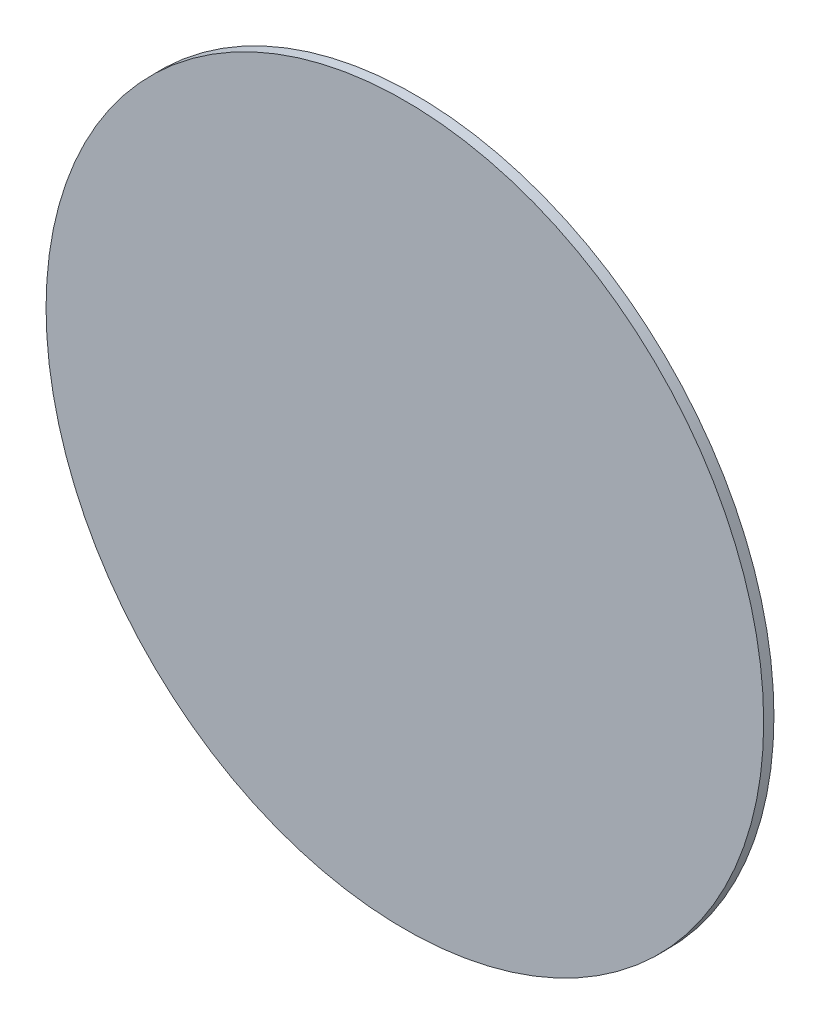
ISO-10303-21;
HEADER;
FILE_DESCRIPTION(('STEP AP214'),'2;1');
FILE_NAME('part.step','',(''),(''),'','','');
FILE_SCHEMA(('AUTOMOTIVE_DESIGN { 1 0 10303 214 1 1 1 1 }'));
ENDSEC;
DATA;
#1=APPLICATION_CONTEXT('core data for automotive mechanical design processes');
#2=APPLICATION_PROTOCOL_DEFINITION('international standard','automotive_design',2000,#1);
#3=PRODUCT_CONTEXT('',#1,'mechanical');
#4=PRODUCT('Part','Part','',(#3));
#5=PRODUCT_RELATED_PRODUCT_CATEGORY('part','',(#4));
#6=PRODUCT_DEFINITION_FORMATION('','',#4);
#7=PRODUCT_DEFINITION_CONTEXT('part definition',#1,'design');
#8=PRODUCT_DEFINITION('design','',#6,#7);
#9=PRODUCT_DEFINITION_SHAPE('','',#8);
#10=(LENGTH_UNIT() NAMED_UNIT(*) SI_UNIT(.MILLI.,.METRE.));
#11=(NAMED_UNIT(*) PLANE_ANGLE_UNIT() SI_UNIT($,.RADIAN.));
#12=(NAMED_UNIT(*) SI_UNIT($,.STERADIAN.) SOLID_ANGLE_UNIT());
#13=UNCERTAINTY_MEASURE_WITH_UNIT(LENGTH_MEASURE(1.E-05),#10,'distance_accuracy_value','');
#14=(GEOMETRIC_REPRESENTATION_CONTEXT(3) GLOBAL_UNCERTAINTY_ASSIGNED_CONTEXT((#13)) GLOBAL_UNIT_ASSIGNED_CONTEXT((#10,
#11,#12)) REPRESENTATION_CONTEXT('',''));
#15=CARTESIAN_POINT('',(0.,0.,0.));
#16=DIRECTION('',(0.,0.,1.));
#17=DIRECTION('',(1.,0.,0.));
#18=AXIS2_PLACEMENT_3D('',#15,#16,#17);
#19=CARTESIAN_POINT('',(0.,0.,2.));
#20=DIRECTION('',(0.,0.,-1.));
#21=DIRECTION('',(-1.,0.,0.));
#22=AXIS2_PLACEMENT_3D('',#19,#20,#21);
#23=CYLINDRICAL_SURFACE('',#22,70.);
#24=CARTESIAN_POINT('',(0.,0.,2.));
#25=DIRECTION('',(0.,0.,1.));
#26=DIRECTION('',(1.,0.,0.));
#27=AXIS2_PLACEMENT_3D('',#24,#25,#26);
#28=CIRCLE('',#27,70.);
#29=CARTESIAN_POINT('',(70.,0.,2.));
#30=VERTEX_POINT('',#29);
#31=EDGE_CURVE('E10',#30,#30,#28,.T.);
#32=ORIENTED_EDGE('',*,*,#31,.F.);
#33=EDGE_LOOP('',(#32));
#34=FACE_BOUND('',#33,.T.);
#35=CARTESIAN_POINT('',(0.,0.,0.));
#36=DIRECTION('',(0.,0.,1.));
#37=DIRECTION('',(1.,0.,0.));
#38=AXIS2_PLACEMENT_3D('',#35,#36,#37);
#39=CIRCLE('',#38,70.);
#40=CARTESIAN_POINT('',(70.,0.,0.));
#41=VERTEX_POINT('',#40);
#42=EDGE_CURVE('E34',#41,#41,#39,.T.);
#43=ORIENTED_EDGE('',*,*,#42,.T.);
#44=EDGE_LOOP('',(#43));
#45=FACE_BOUND('',#44,.T.);
#46=ADVANCED_FACE('F31',(#34,#45),#23,.T.);
#47=CARTESIAN_POINT('',(0.,0.,2.));
#48=DIRECTION('',(0.,0.,1.));
#49=DIRECTION('',(1.,0.,0.));
#50=AXIS2_PLACEMENT_3D('',#47,#48,#49);
#51=PLANE('',#50);
#52=ORIENTED_EDGE('',*,*,#31,.T.);
#53=EDGE_LOOP('',(#52));
#54=FACE_BOUND('',#53,.T.);
#55=ADVANCED_FACE('F46',(#54),#51,.T.);
#56=CARTESIAN_POINT('',(0.,0.,0.));
#57=DIRECTION('',(0.,0.,1.));
#58=DIRECTION('',(1.,0.,0.));
#59=AXIS2_PLACEMENT_3D('',#56,#57,#58);
#60=PLANE('',#59);
#61=ORIENTED_EDGE('',*,*,#42,.F.);
#62=EDGE_LOOP('',(#61));
#63=FACE_BOUND('',#62,.T.);
#64=ADVANCED_FACE('F44',(#63),#60,.F.);
#65=CLOSED_SHELL('',(#46,#55,#64));
#66=MANIFOLD_SOLID_BREP('B2',#65);
#67=ADVANCED_BREP_SHAPE_REPRESENTATION('',(#18,#66),#14);
#68=SHAPE_DEFINITION_REPRESENTATION(#9,#67);
ENDSEC;
END-ISO-10303-21;
